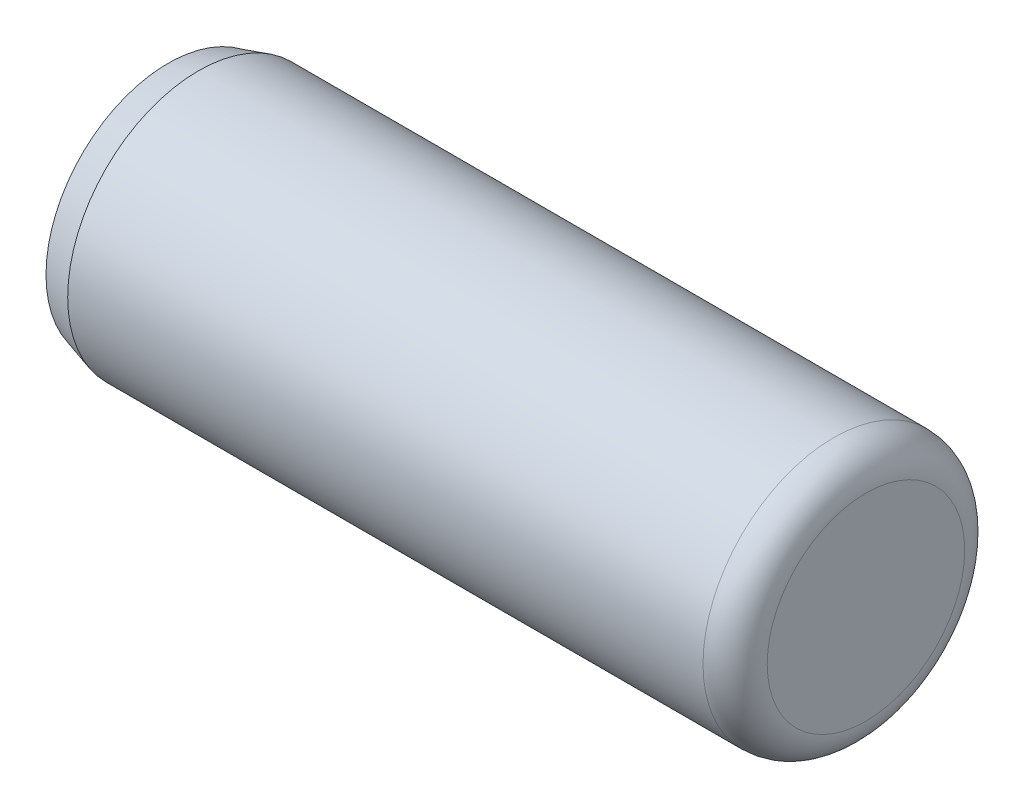
ISO-10303-21;
HEADER;
FILE_DESCRIPTION(('STEP AP214'),'2;1');
FILE_NAME('part.step','',(''),(''),'','','');
FILE_SCHEMA(('AUTOMOTIVE_DESIGN { 1 0 10303 214 1 1 1 1 }'));
ENDSEC;
DATA;
#1=APPLICATION_CONTEXT('core data for automotive mechanical design processes');
#2=APPLICATION_PROTOCOL_DEFINITION('international standard','automotive_design',2000,#1);
#3=PRODUCT_CONTEXT('',#1,'mechanical');
#4=PRODUCT('Part','Part','',(#3));
#5=PRODUCT_RELATED_PRODUCT_CATEGORY('part','',(#4));
#6=PRODUCT_DEFINITION_FORMATION('','',#4);
#7=PRODUCT_DEFINITION_CONTEXT('part definition',#1,'design');
#8=PRODUCT_DEFINITION('design','',#6,#7);
#9=PRODUCT_DEFINITION_SHAPE('','',#8);
#10=(LENGTH_UNIT() NAMED_UNIT(*) SI_UNIT(.MILLI.,.METRE.));
#11=(NAMED_UNIT(*) PLANE_ANGLE_UNIT() SI_UNIT($,.RADIAN.));
#12=(NAMED_UNIT(*) SI_UNIT($,.STERADIAN.) SOLID_ANGLE_UNIT());
#13=UNCERTAINTY_MEASURE_WITH_UNIT(LENGTH_MEASURE(1.E-05),#10,'distance_accuracy_value','');
#14=(GEOMETRIC_REPRESENTATION_CONTEXT(3) GLOBAL_UNCERTAINTY_ASSIGNED_CONTEXT((#13)) GLOBAL_UNIT_ASSIGNED_CONTEXT((#10,
#11,#12)) REPRESENTATION_CONTEXT('',''));
#15=CARTESIAN_POINT('',(0.,0.,0.));
#16=DIRECTION('',(0.,0.,1.));
#17=DIRECTION('',(1.,0.,0.));
#18=AXIS2_PLACEMENT_3D('',#15,#16,#17);
#19=CARTESIAN_POINT('',(5.7658,0.,0.));
#20=DIRECTION('',(-1.,0.,0.));
#21=DIRECTION('',(0.,0.,1.));
#22=AXIS2_PLACEMENT_3D('',#19,#20,#21);
#23=TOROIDAL_SURFACE('',#22,1.79705,0.5842);
#24=CARTESIAN_POINT('',(5.7658,0.,0.));
#25=DIRECTION('',(-1.,0.,0.));
#26=DIRECTION('',(0.,0.,1.));
#27=AXIS2_PLACEMENT_3D('',#24,#25,#26);
#28=CIRCLE('',#27,2.38125);
#29=CARTESIAN_POINT('',(5.7658,0.,2.38125));
#30=VERTEX_POINT('',#29);
#31=EDGE_CURVE('E10',#30,#30,#28,.T.);
#32=ORIENTED_EDGE('',*,*,#31,.F.);
#33=EDGE_LOOP('',(#32));
#34=FACE_BOUND('',#33,.T.);
#35=CARTESIAN_POINT('',(6.35,0.,0.));
#36=DIRECTION('',(-1.,0.,0.));
#37=DIRECTION('',(0.,0.,1.));
#38=AXIS2_PLACEMENT_3D('',#35,#36,#37);
#39=CIRCLE('',#38,1.79705);
#40=CARTESIAN_POINT('',(6.35,0.,1.79705));
#41=VERTEX_POINT('',#40);
#42=EDGE_CURVE('E49',#41,#41,#39,.T.);
#43=ORIENTED_EDGE('',*,*,#42,.T.);
#44=EDGE_LOOP('',(#43));
#45=FACE_BOUND('',#44,.T.);
#46=ADVANCED_FACE('F35',(#34,#45),#23,.T.);
#47=CARTESIAN_POINT('',(-6.35,0.,0.));
#48=DIRECTION('',(-1.,0.,0.));
#49=DIRECTION('',(0.,0.,1.));
#50=AXIS2_PLACEMENT_3D('',#47,#48,#49);
#51=CYLINDRICAL_SURFACE('',#50,2.38125);
#52=CARTESIAN_POINT('',(-5.79637295704025,0.,0.));
#53=DIRECTION('',(-1.,0.,0.));
#54=DIRECTION('',(0.,0.,1.));
#55=AXIS2_PLACEMENT_3D('',#52,#53,#54);
#56=CIRCLE('',#55,2.38125);
#57=CARTESIAN_POINT('',(-5.79637295704025,0.,2.38125));
#58=VERTEX_POINT('',#57);
#59=EDGE_CURVE('E41',#58,#58,#56,.T.);
#60=ORIENTED_EDGE('',*,*,#59,.F.);
#61=EDGE_LOOP('',(#60));
#62=FACE_BOUND('',#61,.T.);
#63=ORIENTED_EDGE('',*,*,#31,.T.);
#64=EDGE_LOOP('',(#63));
#65=FACE_BOUND('',#64,.T.);
#66=ADVANCED_FACE('F67',(#62,#65),#51,.T.);
#67=CARTESIAN_POINT('',(-5.79637295704025,0.,0.));
#68=DIRECTION('',(1.,0.,0.));
#69=DIRECTION('',(0.,0.,-1.));
#70=AXIS2_PLACEMENT_3D('',#67,#68,#69);
#71=CONICAL_SURFACE('',#70,2.38125,0.279252680319092);
#72=CARTESIAN_POINT('',(-6.35,0.,0.));
#73=DIRECTION('',(-1.,0.,0.));
#74=DIRECTION('',(0.,0.,1.));
#75=AXIS2_PLACEMENT_3D('',#72,#73,#74);
#76=CIRCLE('',#75,2.2225);
#77=CARTESIAN_POINT('',(-6.35,0.,2.2225));
#78=VERTEX_POINT('',#77);
#79=EDGE_CURVE('E45',#78,#78,#76,.T.);
#80=ORIENTED_EDGE('',*,*,#79,.F.);
#81=EDGE_LOOP('',(#80));
#82=FACE_BOUND('',#81,.T.);
#83=ORIENTED_EDGE('',*,*,#59,.T.);
#84=EDGE_LOOP('',(#83));
#85=FACE_BOUND('',#84,.T.);
#86=ADVANCED_FACE('F63',(#82,#85),#71,.T.);
#87=CARTESIAN_POINT('',(-6.35,2.2225,0.));
#88=DIRECTION('',(1.,0.,0.));
#89=DIRECTION('',(0.,0.,-1.));
#90=AXIS2_PLACEMENT_3D('',#87,#88,#89);
#91=PLANE('',#90);
#92=ORIENTED_EDGE('',*,*,#79,.T.);
#93=EDGE_LOOP('',(#92));
#94=FACE_BOUND('',#93,.T.);
#95=ADVANCED_FACE('F58',(#94),#91,.F.);
#96=CARTESIAN_POINT('',(6.35,1.79705,0.));
#97=DIRECTION('',(-1.,0.,0.));
#98=DIRECTION('',(0.,0.,1.));
#99=AXIS2_PLACEMENT_3D('',#96,#97,#98);
#100=PLANE('',#99);
#101=ORIENTED_EDGE('',*,*,#42,.F.);
#102=EDGE_LOOP('',(#101));
#103=FACE_BOUND('',#102,.T.);
#104=ADVANCED_FACE('F56',(#103),#100,.F.);
#105=CLOSED_SHELL('',(#46,#66,#86,#95,#104));
#106=MANIFOLD_SOLID_BREP('B2',#105);
#107=ADVANCED_BREP_SHAPE_REPRESENTATION('',(#18,#106),#14);
#108=SHAPE_DEFINITION_REPRESENTATION(#9,#107);
ENDSEC;
END-ISO-10303-21;
